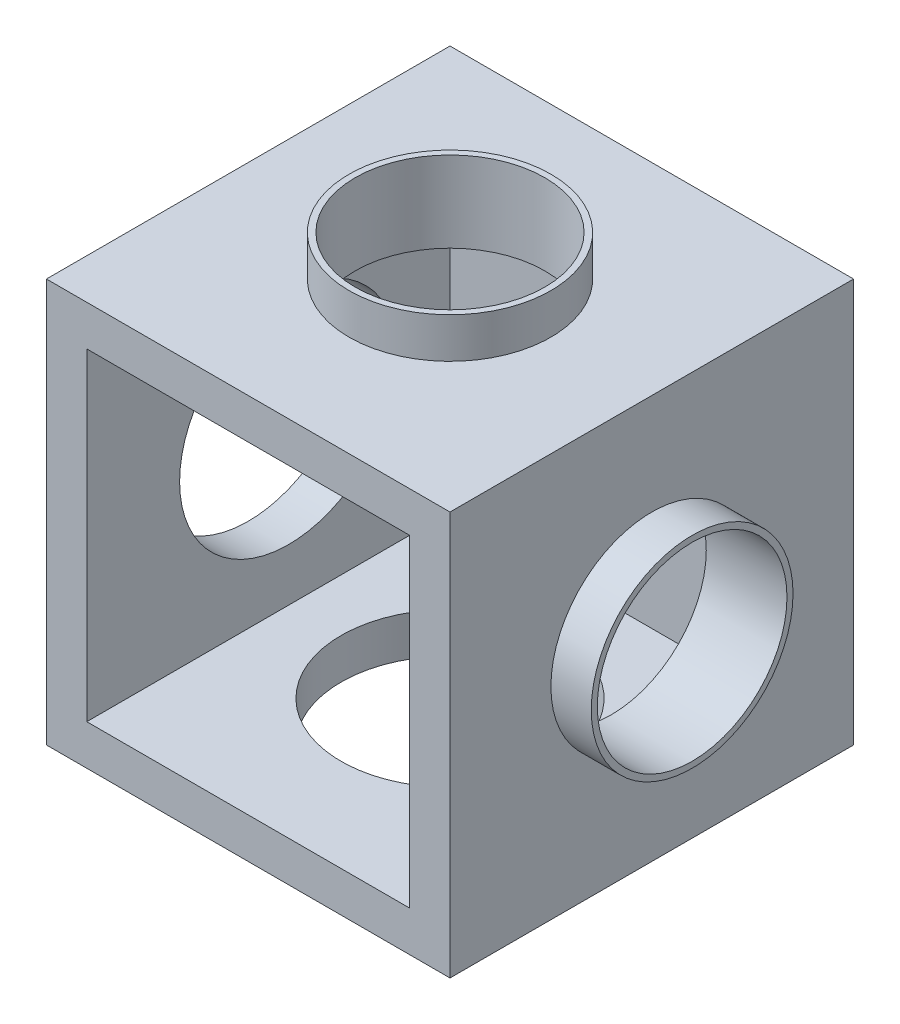
ISO-10303-21;
HEADER;
FILE_DESCRIPTION(('STEP AP214'),'2;1');
FILE_NAME('part.step','',(''),(''),'','','');
FILE_SCHEMA(('AUTOMOTIVE_DESIGN { 1 0 10303 214 1 1 1 1 }'));
ENDSEC;
DATA;
#1=APPLICATION_CONTEXT('core data for automotive mechanical design processes');
#2=APPLICATION_PROTOCOL_DEFINITION('international standard','automotive_design',2000,#1);
#3=PRODUCT_CONTEXT('',#1,'mechanical');
#4=PRODUCT('Part','Part','',(#3));
#5=PRODUCT_RELATED_PRODUCT_CATEGORY('part','',(#4));
#6=PRODUCT_DEFINITION_FORMATION('','',#4);
#7=PRODUCT_DEFINITION_CONTEXT('part definition',#1,'design');
#8=PRODUCT_DEFINITION('design','',#6,#7);
#9=PRODUCT_DEFINITION_SHAPE('','',#8);
#10=(LENGTH_UNIT() NAMED_UNIT(*) SI_UNIT(.MILLI.,.METRE.));
#11=(NAMED_UNIT(*) PLANE_ANGLE_UNIT() SI_UNIT($,.RADIAN.));
#12=(NAMED_UNIT(*) SI_UNIT($,.STERADIAN.) SOLID_ANGLE_UNIT());
#13=UNCERTAINTY_MEASURE_WITH_UNIT(LENGTH_MEASURE(1.E-05),#10,'distance_accuracy_value','');
#14=(GEOMETRIC_REPRESENTATION_CONTEXT(3) GLOBAL_UNCERTAINTY_ASSIGNED_CONTEXT((#13)) GLOBAL_UNIT_ASSIGNED_CONTEXT((#10,
#11,#12)) REPRESENTATION_CONTEXT('',''));
#15=CARTESIAN_POINT('',(0.,0.,0.));
#16=DIRECTION('',(0.,0.,1.));
#17=DIRECTION('',(1.,0.,0.));
#18=AXIS2_PLACEMENT_3D('',#15,#16,#17);
#19=CARTESIAN_POINT('',(50.,50.,0.));
#20=DIRECTION('',(-1.,0.,0.));
#21=DIRECTION('',(0.,0.,1.));
#22=AXIS2_PLACEMENT_3D('',#19,#20,#21);
#23=PLANE('',#22);
#24=DIRECTION('',(0.,0.,-1.));
#25=VECTOR('',#24,1.);
#26=CARTESIAN_POINT('',(50.,0.,0.));
#27=LINE('',#26,#25);
#28=CARTESIAN_POINT('',(50.,0.,0.));
#29=VERTEX_POINT('',#28);
#30=CARTESIAN_POINT('',(50.,0.,-50.));
#31=VERTEX_POINT('',#30);
#32=EDGE_CURVE('E162',#29,#31,#27,.T.);
#33=ORIENTED_EDGE('',*,*,#32,.T.);
#34=DIRECTION('',(0.,-1.,0.));
#35=VECTOR('',#34,1.);
#36=CARTESIAN_POINT('',(50.,50.,-50.));
#37=LINE('',#36,#35);
#38=CARTESIAN_POINT('',(50.,50.,-50.));
#39=VERTEX_POINT('',#38);
#40=EDGE_CURVE('E166',#39,#31,#37,.T.);
#41=ORIENTED_EDGE('',*,*,#40,.F.);
#42=DIRECTION('',(0.,0.,-1.));
#43=VECTOR('',#42,1.);
#44=CARTESIAN_POINT('',(50.,50.,0.));
#45=LINE('',#44,#43);
#46=CARTESIAN_POINT('',(50.,50.,0.));
#47=VERTEX_POINT('',#46);
#48=EDGE_CURVE('E154',#47,#39,#45,.T.);
#49=ORIENTED_EDGE('',*,*,#48,.F.);
#50=DIRECTION('',(0.,-1.,0.));
#51=VECTOR('',#50,1.);
#52=CARTESIAN_POINT('',(50.,50.,0.));
#53=LINE('',#52,#51);
#54=EDGE_CURVE('E168',#47,#29,#53,.T.);
#55=ORIENTED_EDGE('',*,*,#54,.T.);
#56=EDGE_LOOP('',(#33,#41,#49,#55));
#57=FACE_BOUND('',#56,.T.);
#58=CARTESIAN_POINT('',(50.,25.,-25.));
#59=DIRECTION('',(-1.,0.,0.));
#60=DIRECTION('',(0.,0.,1.));
#61=AXIS2_PLACEMENT_3D('',#58,#59,#60);
#62=CIRCLE('',#61,12.5);
#63=CARTESIAN_POINT('',(50.,25.,-12.5));
#64=VERTEX_POINT('',#63);
#65=EDGE_CURVE('E11',#64,#64,#62,.F.);
#66=ORIENTED_EDGE('',*,*,#65,.F.);
#67=EDGE_LOOP('',(#66));
#68=FACE_BOUND('',#67,.T.);
#69=ADVANCED_FACE('F34',(#57,#68),#23,.F.);
#70=CARTESIAN_POINT('',(0.,50.,0.));
#71=DIRECTION('',(0.,-1.,0.));
#72=DIRECTION('',(0.,0.,-1.));
#73=AXIS2_PLACEMENT_3D('',#70,#71,#72);
#74=PLANE('',#73);
#75=DIRECTION('',(0.,0.,1.));
#76=VECTOR('',#75,1.);
#77=CARTESIAN_POINT('',(0.,50.,0.));
#78=LINE('',#77,#76);
#79=CARTESIAN_POINT('',(0.,50.,-50.));
#80=VERTEX_POINT('',#79);
#81=CARTESIAN_POINT('',(0.,50.,0.));
#82=VERTEX_POINT('',#81);
#83=EDGE_CURVE('E151',#80,#82,#78,.T.);
#84=ORIENTED_EDGE('',*,*,#83,.T.);
#85=DIRECTION('',(1.,0.,0.));
#86=VECTOR('',#85,1.);
#87=CARTESIAN_POINT('',(0.,50.,0.));
#88=LINE('',#87,#86);
#89=EDGE_CURVE('E87',#82,#47,#88,.T.);
#90=ORIENTED_EDGE('',*,*,#89,.T.);
#91=ORIENTED_EDGE('',*,*,#48,.T.);
#92=DIRECTION('',(-1.,0.,0.));
#93=VECTOR('',#92,1.);
#94=CARTESIAN_POINT('',(0.,50.,-50.));
#95=LINE('',#94,#93);
#96=EDGE_CURVE('E58',#39,#80,#95,.T.);
#97=ORIENTED_EDGE('',*,*,#96,.T.);
#98=EDGE_LOOP('',(#84,#90,#91,#97));
#99=FACE_BOUND('',#98,.T.);
#100=CARTESIAN_POINT('',(25.,50.,-25.));
#101=DIRECTION('',(0.,-1.,0.));
#102=DIRECTION('',(0.,0.,-1.));
#103=AXIS2_PLACEMENT_3D('',#100,#101,#102);
#104=CIRCLE('',#103,12.5);
#105=CARTESIAN_POINT('',(25.,50.,-37.5));
#106=VERTEX_POINT('',#105);
#107=EDGE_CURVE('E42',#106,#106,#104,.F.);
#108=ORIENTED_EDGE('',*,*,#107,.F.);
#109=EDGE_LOOP('',(#108));
#110=FACE_BOUND('',#109,.T.);
#111=ADVANCED_FACE('F177',(#99,#110),#74,.F.);
#112=CARTESIAN_POINT('',(0.,50.,0.));
#113=DIRECTION('',(1.,0.,0.));
#114=DIRECTION('',(0.,0.,-1.));
#115=AXIS2_PLACEMENT_3D('',#112,#113,#114);
#116=PLANE('',#115);
#117=CARTESIAN_POINT('',(0.,25.,-25.));
#118=DIRECTION('',(-1.,0.,0.));
#119=DIRECTION('',(0.,0.,1.));
#120=AXIS2_PLACEMENT_3D('',#117,#118,#119);
#121=CIRCLE('',#120,13.5);
#122=CARTESIAN_POINT('',(0.,25.,-11.5));
#123=VERTEX_POINT('',#122);
#124=EDGE_CURVE('E263',#123,#123,#121,.T.);
#125=ORIENTED_EDGE('',*,*,#124,.F.);
#126=EDGE_LOOP('',(#125));
#127=FACE_BOUND('',#126,.T.);
#128=DIRECTION('',(0.,0.,1.));
#129=VECTOR('',#128,1.);
#130=CARTESIAN_POINT('',(0.,0.,0.));
#131=LINE('',#130,#129);
#132=CARTESIAN_POINT('',(0.,0.,-50.));
#133=VERTEX_POINT('',#132);
#134=CARTESIAN_POINT('',(0.,0.,0.));
#135=VERTEX_POINT('',#134);
#136=EDGE_CURVE('E147',#133,#135,#131,.T.);
#137=ORIENTED_EDGE('',*,*,#136,.T.);
#138=DIRECTION('',(0.,-1.,0.));
#139=VECTOR('',#138,1.);
#140=CARTESIAN_POINT('',(0.,50.,0.));
#141=LINE('',#140,#139);
#142=EDGE_CURVE('E171',#82,#135,#141,.T.);
#143=ORIENTED_EDGE('',*,*,#142,.F.);
#144=ORIENTED_EDGE('',*,*,#83,.F.);
#145=DIRECTION('',(0.,-1.,0.));
#146=VECTOR('',#145,1.);
#147=CARTESIAN_POINT('',(0.,50.,-50.));
#148=LINE('',#147,#146);
#149=EDGE_CURVE('E157',#80,#133,#148,.T.);
#150=ORIENTED_EDGE('',*,*,#149,.T.);
#151=EDGE_LOOP('',(#137,#143,#144,#150));
#152=FACE_BOUND('',#151,.T.);
#153=ADVANCED_FACE('F36',(#127,#152),#116,.F.);
#154=CARTESIAN_POINT('',(0.,50.,0.));
#155=DIRECTION('',(0.,0.,-1.));
#156=DIRECTION('',(-1.,0.,0.));
#157=AXIS2_PLACEMENT_3D('',#154,#155,#156);
#158=PLANE('',#157);
#159=DIRECTION('',(1.,0.,0.));
#160=VECTOR('',#159,1.);
#161=CARTESIAN_POINT('',(5.,5.,0.));
#162=LINE('',#161,#160);
#163=CARTESIAN_POINT('',(5.,5.,0.));
#164=VERTEX_POINT('',#163);
#165=CARTESIAN_POINT('',(45.,5.,0.));
#166=VERTEX_POINT('',#165);
#167=EDGE_CURVE('E141',#164,#166,#162,.T.);
#168=ORIENTED_EDGE('',*,*,#167,.F.);
#169=DIRECTION('',(0.,-1.,0.));
#170=VECTOR('',#169,1.);
#171=CARTESIAN_POINT('',(5.,45.,0.));
#172=LINE('',#171,#170);
#173=CARTESIAN_POINT('',(5.,45.,0.));
#174=VERTEX_POINT('',#173);
#175=EDGE_CURVE('E49',#174,#164,#172,.T.);
#176=ORIENTED_EDGE('',*,*,#175,.F.);
#177=DIRECTION('',(-1.,0.,0.));
#178=VECTOR('',#177,1.);
#179=CARTESIAN_POINT('',(5.,45.,0.));
#180=LINE('',#179,#178);
#181=CARTESIAN_POINT('',(45.,45.,0.));
#182=VERTEX_POINT('',#181);
#183=EDGE_CURVE('E129',#182,#174,#180,.T.);
#184=ORIENTED_EDGE('',*,*,#183,.F.);
#185=DIRECTION('',(0.,1.,0.));
#186=VECTOR('',#185,1.);
#187=CARTESIAN_POINT('',(45.,45.,0.));
#188=LINE('',#187,#186);
#189=EDGE_CURVE('E132',#166,#182,#188,.T.);
#190=ORIENTED_EDGE('',*,*,#189,.F.);
#191=EDGE_LOOP('',(#168,#176,#184,#190));
#192=FACE_BOUND('',#191,.T.);
#193=DIRECTION('',(1.,0.,0.));
#194=VECTOR('',#193,1.);
#195=CARTESIAN_POINT('',(0.,0.,0.));
#196=LINE('',#195,#194);
#197=EDGE_CURVE('E160',#135,#29,#196,.T.);
#198=ORIENTED_EDGE('',*,*,#197,.T.);
#199=ORIENTED_EDGE('',*,*,#54,.F.);
#200=ORIENTED_EDGE('',*,*,#89,.F.);
#201=ORIENTED_EDGE('',*,*,#142,.T.);
#202=EDGE_LOOP('',(#198,#199,#200,#201));
#203=FACE_BOUND('',#202,.T.);
#204=ADVANCED_FACE('F184',(#192,#203),#158,.F.);
#205=CARTESIAN_POINT('',(0.,50.,-50.));
#206=DIRECTION('',(0.,0.,1.));
#207=DIRECTION('',(1.,0.,0.));
#208=AXIS2_PLACEMENT_3D('',#205,#206,#207);
#209=PLANE('',#208);
#210=DIRECTION('',(-1.,0.,0.));
#211=VECTOR('',#210,1.);
#212=CARTESIAN_POINT('',(0.,0.,-50.));
#213=LINE('',#212,#211);
#214=EDGE_CURVE('E79',#31,#133,#213,.T.);
#215=ORIENTED_EDGE('',*,*,#214,.T.);
#216=ORIENTED_EDGE('',*,*,#149,.F.);
#217=ORIENTED_EDGE('',*,*,#96,.F.);
#218=ORIENTED_EDGE('',*,*,#40,.T.);
#219=EDGE_LOOP('',(#215,#216,#217,#218));
#220=FACE_BOUND('',#219,.T.);
#221=ADVANCED_FACE('F194',(#220),#209,.F.);
#222=CARTESIAN_POINT('',(0.,0.,0.));
#223=DIRECTION('',(0.,-1.,0.));
#224=DIRECTION('',(0.,0.,-1.));
#225=AXIS2_PLACEMENT_3D('',#222,#223,#224);
#226=PLANE('',#225);
#227=CARTESIAN_POINT('',(25.,0.,-25.));
#228=DIRECTION('',(0.,-1.,0.));
#229=DIRECTION('',(0.,0.,-1.));
#230=AXIS2_PLACEMENT_3D('',#227,#228,#229);
#231=CIRCLE('',#230,13.5);
#232=CARTESIAN_POINT('',(25.,0.,-38.5));
#233=VERTEX_POINT('',#232);
#234=EDGE_CURVE('E254',#233,#233,#231,.T.);
#235=ORIENTED_EDGE('',*,*,#234,.F.);
#236=EDGE_LOOP('',(#235));
#237=FACE_BOUND('',#236,.T.);
#238=ORIENTED_EDGE('',*,*,#136,.F.);
#239=ORIENTED_EDGE('',*,*,#214,.F.);
#240=ORIENTED_EDGE('',*,*,#32,.F.);
#241=ORIENTED_EDGE('',*,*,#197,.F.);
#242=EDGE_LOOP('',(#238,#239,#240,#241));
#243=FACE_BOUND('',#242,.T.);
#244=ADVANCED_FACE('F191',(#237,#243),#226,.T.);
#245=CARTESIAN_POINT('',(5.,45.,-45.));
#246=DIRECTION('',(-1.,0.,0.));
#247=DIRECTION('',(0.,-1.,0.));
#248=AXIS2_PLACEMENT_3D('',#245,#246,#247);
#249=PLANE('',#248);
#250=CARTESIAN_POINT('',(5.,25.,-25.));
#251=DIRECTION('',(-1.,0.,0.));
#252=DIRECTION('',(0.,0.,1.));
#253=AXIS2_PLACEMENT_3D('',#250,#251,#252);
#254=CIRCLE('',#253,13.5);
#255=CARTESIAN_POINT('',(5.,25.,-11.5));
#256=VERTEX_POINT('',#255);
#257=EDGE_CURVE('E262',#256,#256,#254,.T.);
#258=ORIENTED_EDGE('',*,*,#257,.T.);
#259=EDGE_LOOP('',(#258));
#260=FACE_BOUND('',#259,.T.);
#261=ORIENTED_EDGE('',*,*,#175,.T.);
#262=DIRECTION('',(0.,0.,1.));
#263=VECTOR('',#262,1.);
#264=CARTESIAN_POINT('',(5.,5.,-45.));
#265=LINE('',#264,#263);
#266=CARTESIAN_POINT('',(5.,5.,-45.));
#267=VERTEX_POINT('',#266);
#268=EDGE_CURVE('E107',#267,#164,#265,.T.);
#269=ORIENTED_EDGE('',*,*,#268,.F.);
#270=DIRECTION('',(0.,-1.,0.));
#271=VECTOR('',#270,1.);
#272=CARTESIAN_POINT('',(5.,45.,-45.));
#273=LINE('',#272,#271);
#274=CARTESIAN_POINT('',(5.,45.,-45.));
#275=VERTEX_POINT('',#274);
#276=EDGE_CURVE('E111',#275,#267,#273,.T.);
#277=ORIENTED_EDGE('',*,*,#276,.F.);
#278=DIRECTION('',(0.,0.,1.));
#279=VECTOR('',#278,1.);
#280=CARTESIAN_POINT('',(5.,45.,-45.));
#281=LINE('',#280,#279);
#282=EDGE_CURVE('E145',#275,#174,#281,.T.);
#283=ORIENTED_EDGE('',*,*,#282,.T.);
#284=EDGE_LOOP('',(#261,#269,#277,#283));
#285=FACE_BOUND('',#284,.T.);
#286=ADVANCED_FACE('F109',(#260,#285),#249,.F.);
#287=CARTESIAN_POINT('',(5.,45.,-45.));
#288=DIRECTION('',(0.,1.,0.));
#289=DIRECTION('',(0.,0.,1.));
#290=AXIS2_PLACEMENT_3D('',#287,#288,#289);
#291=PLANE('',#290);
#292=CARTESIAN_POINT('',(25.,45.,-25.));
#293=DIRECTION('',(0.,1.,0.));
#294=DIRECTION('',(0.,0.,1.));
#295=AXIS2_PLACEMENT_3D('',#292,#293,#294);
#296=CIRCLE('',#295,11.75);
#297=CARTESIAN_POINT('',(25.,45.,-13.25));
#298=VERTEX_POINT('',#297);
#299=EDGE_CURVE('E266',#298,#298,#296,.T.);
#300=ORIENTED_EDGE('',*,*,#299,.T.);
#301=EDGE_LOOP('',(#300));
#302=FACE_BOUND('',#301,.T.);
#303=ORIENTED_EDGE('',*,*,#183,.T.);
#304=ORIENTED_EDGE('',*,*,#282,.F.);
#305=DIRECTION('',(-1.,0.,0.));
#306=VECTOR('',#305,1.);
#307=CARTESIAN_POINT('',(5.,45.,-45.));
#308=LINE('',#307,#306);
#309=CARTESIAN_POINT('',(45.,45.,-45.));
#310=VERTEX_POINT('',#309);
#311=EDGE_CURVE('E117',#310,#275,#308,.T.);
#312=ORIENTED_EDGE('',*,*,#311,.F.);
#313=DIRECTION('',(0.,0.,1.));
#314=VECTOR('',#313,1.);
#315=CARTESIAN_POINT('',(45.,45.,-45.));
#316=LINE('',#315,#314);
#317=EDGE_CURVE('E148',#310,#182,#316,.T.);
#318=ORIENTED_EDGE('',*,*,#317,.T.);
#319=EDGE_LOOP('',(#303,#304,#312,#318));
#320=FACE_BOUND('',#319,.T.);
#321=ADVANCED_FACE('F240',(#302,#320),#291,.F.);
#322=CARTESIAN_POINT('',(45.,45.,-45.));
#323=DIRECTION('',(1.,0.,0.));
#324=DIRECTION('',(0.,1.,0.));
#325=AXIS2_PLACEMENT_3D('',#322,#323,#324);
#326=PLANE('',#325);
#327=CARTESIAN_POINT('',(45.,25.,-25.));
#328=DIRECTION('',(1.,0.,0.));
#329=DIRECTION('',(0.,0.,-1.));
#330=AXIS2_PLACEMENT_3D('',#327,#328,#329);
#331=CIRCLE('',#330,11.75);
#332=CARTESIAN_POINT('',(45.,25.,-36.75));
#333=VERTEX_POINT('',#332);
#334=EDGE_CURVE('E272',#333,#333,#331,.T.);
#335=ORIENTED_EDGE('',*,*,#334,.T.);
#336=EDGE_LOOP('',(#335));
#337=FACE_BOUND('',#336,.T.);
#338=ORIENTED_EDGE('',*,*,#189,.T.);
#339=ORIENTED_EDGE('',*,*,#317,.F.);
#340=DIRECTION('',(0.,1.,0.));
#341=VECTOR('',#340,1.);
#342=CARTESIAN_POINT('',(45.,45.,-45.));
#343=LINE('',#342,#341);
#344=CARTESIAN_POINT('',(45.,5.,-45.));
#345=VERTEX_POINT('',#344);
#346=EDGE_CURVE('E125',#345,#310,#343,.T.);
#347=ORIENTED_EDGE('',*,*,#346,.F.);
#348=DIRECTION('',(0.,0.,1.));
#349=VECTOR('',#348,1.);
#350=CARTESIAN_POINT('',(45.,5.,-45.));
#351=LINE('',#350,#349);
#352=EDGE_CURVE('E116',#345,#166,#351,.T.);
#353=ORIENTED_EDGE('',*,*,#352,.T.);
#354=EDGE_LOOP('',(#338,#339,#347,#353));
#355=FACE_BOUND('',#354,.T.);
#356=ADVANCED_FACE('F243',(#337,#355),#326,.F.);
#357=CARTESIAN_POINT('',(5.,5.,-45.));
#358=DIRECTION('',(0.,-1.,0.));
#359=DIRECTION('',(0.,0.,-1.));
#360=AXIS2_PLACEMENT_3D('',#357,#358,#359);
#361=PLANE('',#360);
#362=CARTESIAN_POINT('',(25.,5.,-25.));
#363=DIRECTION('',(0.,-1.,0.));
#364=DIRECTION('',(0.,0.,-1.));
#365=AXIS2_PLACEMENT_3D('',#362,#363,#364);
#366=CIRCLE('',#365,13.5);
#367=CARTESIAN_POINT('',(25.,5.,-38.5));
#368=VERTEX_POINT('',#367);
#369=EDGE_CURVE('E253',#368,#368,#366,.T.);
#370=ORIENTED_EDGE('',*,*,#369,.T.);
#371=EDGE_LOOP('',(#370));
#372=FACE_BOUND('',#371,.T.);
#373=ORIENTED_EDGE('',*,*,#167,.T.);
#374=ORIENTED_EDGE('',*,*,#352,.F.);
#375=DIRECTION('',(1.,0.,0.));
#376=VECTOR('',#375,1.);
#377=CARTESIAN_POINT('',(5.,5.,-45.));
#378=LINE('',#377,#376);
#379=EDGE_CURVE('E120',#267,#345,#378,.T.);
#380=ORIENTED_EDGE('',*,*,#379,.F.);
#381=ORIENTED_EDGE('',*,*,#268,.T.);
#382=EDGE_LOOP('',(#373,#374,#380,#381));
#383=FACE_BOUND('',#382,.T.);
#384=ADVANCED_FACE('F121',(#372,#383),#361,.F.);
#385=CARTESIAN_POINT('',(0.,0.,-45.));
#386=DIRECTION('',(0.,0.,1.));
#387=DIRECTION('',(1.,0.,0.));
#388=AXIS2_PLACEMENT_3D('',#385,#386,#387);
#389=PLANE('',#388);
#390=ORIENTED_EDGE('',*,*,#276,.T.);
#391=ORIENTED_EDGE('',*,*,#379,.T.);
#392=ORIENTED_EDGE('',*,*,#346,.T.);
#393=ORIENTED_EDGE('',*,*,#311,.T.);
#394=EDGE_LOOP('',(#390,#391,#392,#393));
#395=FACE_BOUND('',#394,.T.);
#396=ADVANCED_FACE('F127',(#395),#389,.T.);
#397=CARTESIAN_POINT('',(25.,55.,-25.));
#398=DIRECTION('',(0.,-1.,0.));
#399=DIRECTION('',(0.,0.,-1.));
#400=AXIS2_PLACEMENT_3D('',#397,#398,#399);
#401=CYLINDRICAL_SURFACE('',#400,12.5);
#402=CARTESIAN_POINT('',(25.,55.,-25.));
#403=DIRECTION('',(0.,1.,0.));
#404=DIRECTION('',(0.,0.,1.));
#405=AXIS2_PLACEMENT_3D('',#402,#403,#404);
#406=CIRCLE('',#405,12.5);
#407=CARTESIAN_POINT('',(25.,55.,-12.5));
#408=VERTEX_POINT('',#407);
#409=EDGE_CURVE('E135',#408,#408,#406,.T.);
#410=ORIENTED_EDGE('',*,*,#409,.F.);
#411=EDGE_LOOP('',(#410));
#412=FACE_BOUND('',#411,.T.);
#413=ORIENTED_EDGE('',*,*,#107,.T.);
#414=EDGE_LOOP('',(#413));
#415=FACE_BOUND('',#414,.T.);
#416=ADVANCED_FACE('F175',(#412,#415),#401,.T.);
#417=CARTESIAN_POINT('',(25.,55.,-25.));
#418=DIRECTION('',(0.,1.,0.));
#419=DIRECTION('',(0.,0.,1.));
#420=AXIS2_PLACEMENT_3D('',#417,#418,#419);
#421=PLANE('',#420);
#422=CARTESIAN_POINT('',(25.,55.,-25.));
#423=DIRECTION('',(0.,1.,0.));
#424=DIRECTION('',(0.,0.,1.));
#425=AXIS2_PLACEMENT_3D('',#422,#423,#424);
#426=CIRCLE('',#425,11.75);
#427=CARTESIAN_POINT('',(25.,55.,-13.25));
#428=VERTEX_POINT('',#427);
#429=EDGE_CURVE('E269',#428,#428,#426,.T.);
#430=ORIENTED_EDGE('',*,*,#429,.F.);
#431=EDGE_LOOP('',(#430));
#432=FACE_BOUND('',#431,.T.);
#433=ORIENTED_EDGE('',*,*,#409,.T.);
#434=EDGE_LOOP('',(#433));
#435=FACE_BOUND('',#434,.T.);
#436=ADVANCED_FACE('F226',(#432,#435),#421,.T.);
#437=CARTESIAN_POINT('',(25.,5.,-25.));
#438=DIRECTION('',(0.,-1.,0.));
#439=DIRECTION('',(0.,0.,-1.));
#440=AXIS2_PLACEMENT_3D('',#437,#438,#439);
#441=CYLINDRICAL_SURFACE('',#440,13.5);
#442=ORIENTED_EDGE('',*,*,#369,.F.);
#443=EDGE_LOOP('',(#442));
#444=FACE_BOUND('',#443,.T.);
#445=ORIENTED_EDGE('',*,*,#234,.T.);
#446=EDGE_LOOP('',(#445));
#447=FACE_BOUND('',#446,.T.);
#448=ADVANCED_FACE('F216',(#444,#447),#441,.F.);
#449=CARTESIAN_POINT('',(55.,25.,-25.));
#450=DIRECTION('',(-1.,0.,0.));
#451=DIRECTION('',(0.,0.,1.));
#452=AXIS2_PLACEMENT_3D('',#449,#450,#451);
#453=CYLINDRICAL_SURFACE('',#452,12.5);
#454=CARTESIAN_POINT('',(55.,25.,-25.));
#455=DIRECTION('',(1.,0.,0.));
#456=DIRECTION('',(0.,0.,-1.));
#457=AXIS2_PLACEMENT_3D('',#454,#455,#456);
#458=CIRCLE('',#457,12.5);
#459=CARTESIAN_POINT('',(55.,25.,-37.5));
#460=VERTEX_POINT('',#459);
#461=EDGE_CURVE('E258',#460,#460,#458,.T.);
#462=ORIENTED_EDGE('',*,*,#461,.F.);
#463=EDGE_LOOP('',(#462));
#464=FACE_BOUND('',#463,.T.);
#465=ORIENTED_EDGE('',*,*,#65,.T.);
#466=EDGE_LOOP('',(#465));
#467=FACE_BOUND('',#466,.T.);
#468=ADVANCED_FACE('F213',(#464,#467),#453,.T.);
#469=CARTESIAN_POINT('',(55.,25.,-25.));
#470=DIRECTION('',(1.,0.,0.));
#471=DIRECTION('',(0.,0.,-1.));
#472=AXIS2_PLACEMENT_3D('',#469,#470,#471);
#473=PLANE('',#472);
#474=CARTESIAN_POINT('',(55.,25.,-25.));
#475=DIRECTION('',(1.,0.,0.));
#476=DIRECTION('',(0.,0.,-1.));
#477=AXIS2_PLACEMENT_3D('',#474,#475,#476);
#478=CIRCLE('',#477,11.75);
#479=CARTESIAN_POINT('',(55.,25.,-36.75));
#480=VERTEX_POINT('',#479);
#481=EDGE_CURVE('E275',#480,#480,#478,.T.);
#482=ORIENTED_EDGE('',*,*,#481,.F.);
#483=EDGE_LOOP('',(#482));
#484=FACE_BOUND('',#483,.T.);
#485=ORIENTED_EDGE('',*,*,#461,.T.);
#486=EDGE_LOOP('',(#485));
#487=FACE_BOUND('',#486,.T.);
#488=ADVANCED_FACE('F215',(#484,#487),#473,.T.);
#489=CARTESIAN_POINT('',(5.,25.,-25.));
#490=DIRECTION('',(-1.,0.,0.));
#491=DIRECTION('',(0.,0.,1.));
#492=AXIS2_PLACEMENT_3D('',#489,#490,#491);
#493=CYLINDRICAL_SURFACE('',#492,13.5);
#494=ORIENTED_EDGE('',*,*,#257,.F.);
#495=EDGE_LOOP('',(#494));
#496=FACE_BOUND('',#495,.T.);
#497=ORIENTED_EDGE('',*,*,#124,.T.);
#498=EDGE_LOOP('',(#497));
#499=FACE_BOUND('',#498,.T.);
#500=ADVANCED_FACE('F223',(#496,#499),#493,.F.);
#501=CARTESIAN_POINT('',(25.,45.,-25.));
#502=DIRECTION('',(0.,1.,0.));
#503=DIRECTION('',(0.,0.,1.));
#504=AXIS2_PLACEMENT_3D('',#501,#502,#503);
#505=CYLINDRICAL_SURFACE('',#504,11.75);
#506=ORIENTED_EDGE('',*,*,#299,.F.);
#507=EDGE_LOOP('',(#506));
#508=FACE_BOUND('',#507,.T.);
#509=ORIENTED_EDGE('',*,*,#429,.T.);
#510=EDGE_LOOP('',(#509));
#511=FACE_BOUND('',#510,.T.);
#512=ADVANCED_FACE('F285',(#508,#511),#505,.F.);
#513=CARTESIAN_POINT('',(45.,25.,-25.));
#514=DIRECTION('',(1.,0.,0.));
#515=DIRECTION('',(0.,0.,-1.));
#516=AXIS2_PLACEMENT_3D('',#513,#514,#515);
#517=CYLINDRICAL_SURFACE('',#516,11.75);
#518=ORIENTED_EDGE('',*,*,#334,.F.);
#519=EDGE_LOOP('',(#518));
#520=FACE_BOUND('',#519,.T.);
#521=ORIENTED_EDGE('',*,*,#481,.T.);
#522=EDGE_LOOP('',(#521));
#523=FACE_BOUND('',#522,.T.);
#524=ADVANCED_FACE('F282',(#520,#523),#517,.F.);
#525=CLOSED_SHELL('',(#69,#111,#153,#204,#221,#244,#286,#321,#356,#384,#396,#416,#436,#448,#468,
#488,#500,#512,#524));
#526=MANIFOLD_SOLID_BREP('B2',#525);
#527=ADVANCED_BREP_SHAPE_REPRESENTATION('',(#18,#526),#14);
#528=SHAPE_DEFINITION_REPRESENTATION(#9,#527);
ENDSEC;
END-ISO-10303-21;
